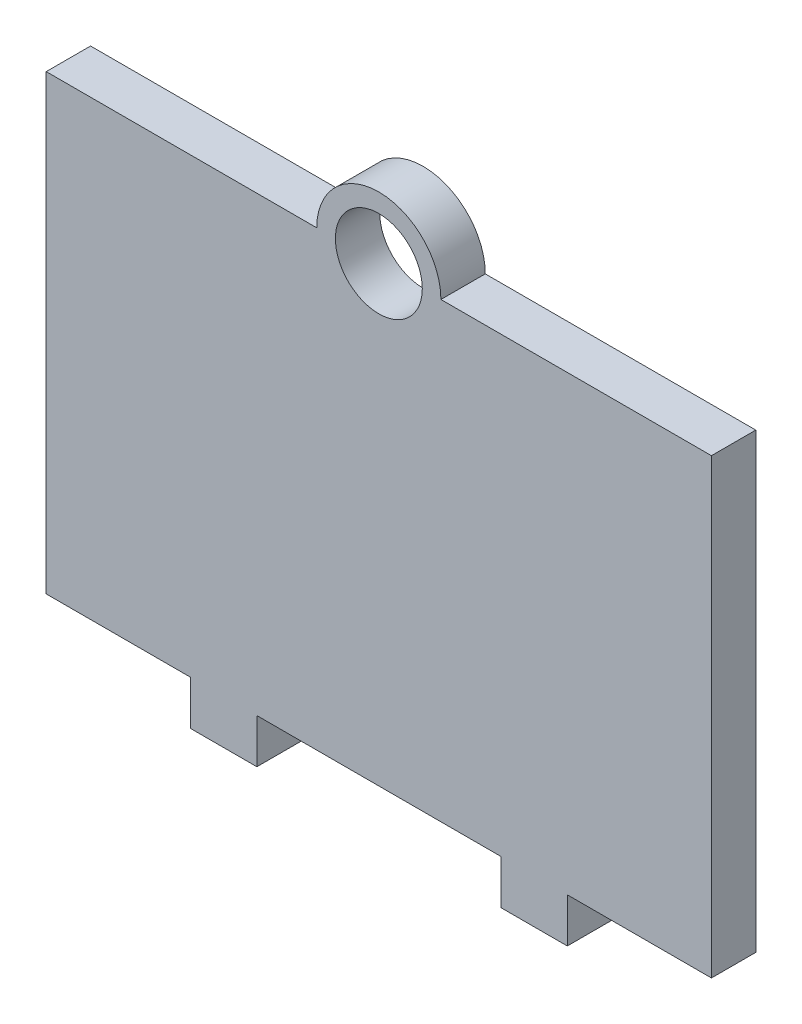
ISO-10303-21;
HEADER;
FILE_DESCRIPTION(('STEP AP214'),'2;1');
FILE_NAME('part.step','',(''),(''),'','','');
FILE_SCHEMA(('AUTOMOTIVE_DESIGN { 1 0 10303 214 1 1 1 1 }'));
ENDSEC;
DATA;
#1=APPLICATION_CONTEXT('core data for automotive mechanical design processes');
#2=APPLICATION_PROTOCOL_DEFINITION('international standard','automotive_design',2000,#1);
#3=PRODUCT_CONTEXT('',#1,'mechanical');
#4=PRODUCT('Part','Part','',(#3));
#5=PRODUCT_RELATED_PRODUCT_CATEGORY('part','',(#4));
#6=PRODUCT_DEFINITION_FORMATION('','',#4);
#7=PRODUCT_DEFINITION_CONTEXT('part definition',#1,'design');
#8=PRODUCT_DEFINITION('design','',#6,#7);
#9=PRODUCT_DEFINITION_SHAPE('','',#8);
#10=(LENGTH_UNIT() NAMED_UNIT(*) SI_UNIT(.MILLI.,.METRE.));
#11=(NAMED_UNIT(*) PLANE_ANGLE_UNIT() SI_UNIT($,.RADIAN.));
#12=(NAMED_UNIT(*) SI_UNIT($,.STERADIAN.) SOLID_ANGLE_UNIT());
#13=UNCERTAINTY_MEASURE_WITH_UNIT(LENGTH_MEASURE(1.E-05),#10,'distance_accuracy_value','');
#14=(GEOMETRIC_REPRESENTATION_CONTEXT(3) GLOBAL_UNCERTAINTY_ASSIGNED_CONTEXT((#13)) GLOBAL_UNIT_ASSIGNED_CONTEXT((#10,
#11,#12)) REPRESENTATION_CONTEXT('',''));
#15=CARTESIAN_POINT('',(0.,0.,0.));
#16=DIRECTION('',(0.,0.,1.));
#17=DIRECTION('',(1.,0.,0.));
#18=AXIS2_PLACEMENT_3D('',#15,#16,#17);
#19=CARTESIAN_POINT('',(-95.25,142.24,-12.7));
#20=DIRECTION('',(-1.,0.,0.));
#21=DIRECTION('',(0.,-1.,0.));
#22=AXIS2_PLACEMENT_3D('',#19,#20,#21);
#23=PLANE('',#22);
#24=DIRECTION('',(0.,-1.,0.));
#25=VECTOR('',#24,1.);
#26=CARTESIAN_POINT('',(-95.25,142.24,0.));
#27=LINE('',#26,#25);
#28=CARTESIAN_POINT('',(-95.25,142.24,0.));
#29=VERTEX_POINT('',#28);
#30=CARTESIAN_POINT('',(-95.25,12.7,0.));
#31=VERTEX_POINT('',#30);
#32=EDGE_CURVE('E176',#29,#31,#27,.T.);
#33=ORIENTED_EDGE('',*,*,#32,.F.);
#34=DIRECTION('',(0.,0.,1.));
#35=VECTOR('',#34,1.);
#36=CARTESIAN_POINT('',(-95.25,142.24,-12.7));
#37=LINE('',#36,#35);
#38=CARTESIAN_POINT('',(-95.25,142.24,-12.7));
#39=VERTEX_POINT('',#38);
#40=EDGE_CURVE('E13',#39,#29,#37,.T.);
#41=ORIENTED_EDGE('',*,*,#40,.F.);
#42=DIRECTION('',(0.,-1.,0.));
#43=VECTOR('',#42,1.);
#44=CARTESIAN_POINT('',(-95.25,142.24,-12.7));
#45=LINE('',#44,#43);
#46=CARTESIAN_POINT('',(-95.25,12.7,-12.7));
#47=VERTEX_POINT('',#46);
#48=EDGE_CURVE('E215',#39,#47,#45,.T.);
#49=ORIENTED_EDGE('',*,*,#48,.T.);
#50=DIRECTION('',(0.,0.,1.));
#51=VECTOR('',#50,1.);
#52=CARTESIAN_POINT('',(-95.25,12.7,-12.7));
#53=LINE('',#52,#51);
#54=EDGE_CURVE('E46',#47,#31,#53,.T.);
#55=ORIENTED_EDGE('',*,*,#54,.T.);
#56=EDGE_LOOP('',(#33,#41,#49,#55));
#57=FACE_BOUND('',#56,.T.);
#58=ADVANCED_FACE('F43',(#57),#23,.T.);
#59=CARTESIAN_POINT('',(-95.25,142.24,-12.7));
#60=DIRECTION('',(0.,1.,0.));
#61=DIRECTION('',(0.,0.,1.));
#62=AXIS2_PLACEMENT_3D('',#59,#60,#61);
#63=PLANE('',#62);
#64=DIRECTION('',(-1.,0.,0.));
#65=VECTOR('',#64,1.);
#66=CARTESIAN_POINT('',(-95.25,142.24,0.));
#67=LINE('',#66,#65);
#68=CARTESIAN_POINT('',(-17.78,142.24,0.));
#69=VERTEX_POINT('',#68);
#70=EDGE_CURVE('E213',#69,#29,#67,.T.);
#71=ORIENTED_EDGE('',*,*,#70,.F.);
#72=DIRECTION('',(0.,0.,1.));
#73=VECTOR('',#72,1.);
#74=CARTESIAN_POINT('',(-17.78,142.24,-12.7));
#75=LINE('',#74,#73);
#76=CARTESIAN_POINT('',(-17.78,142.24,-12.7));
#77=VERTEX_POINT('',#76);
#78=EDGE_CURVE('E52',#77,#69,#75,.T.);
#79=ORIENTED_EDGE('',*,*,#78,.F.);
#80=DIRECTION('',(-1.,0.,0.));
#81=VECTOR('',#80,1.);
#82=CARTESIAN_POINT('',(-95.25,142.24,-12.7));
#83=LINE('',#82,#81);
#84=EDGE_CURVE('E166',#77,#39,#83,.T.);
#85=ORIENTED_EDGE('',*,*,#84,.T.);
#86=ORIENTED_EDGE('',*,*,#40,.T.);
#87=EDGE_LOOP('',(#71,#79,#85,#86));
#88=FACE_BOUND('',#87,.T.);
#89=ADVANCED_FACE('F239',(#88),#63,.T.);
#90=CARTESIAN_POINT('',(0.,142.24,-12.7));
#91=DIRECTION('',(0.,0.,1.));
#92=DIRECTION('',(1.,0.,0.));
#93=AXIS2_PLACEMENT_3D('',#90,#91,#92);
#94=CYLINDRICAL_SURFACE('',#93,17.78);
#95=CARTESIAN_POINT('',(0.,142.24,0.));
#96=DIRECTION('',(0.,0.,1.));
#97=DIRECTION('',(1.,0.,0.));
#98=AXIS2_PLACEMENT_3D('',#95,#96,#97);
#99=CIRCLE('',#98,17.78);
#100=CARTESIAN_POINT('',(17.78,142.24,0.));
#101=VERTEX_POINT('',#100);
#102=EDGE_CURVE('E153',#101,#69,#99,.T.);
#103=ORIENTED_EDGE('',*,*,#102,.F.);
#104=DIRECTION('',(0.,0.,1.));
#105=VECTOR('',#104,1.);
#106=CARTESIAN_POINT('',(17.78,142.24,-12.7));
#107=LINE('',#106,#105);
#108=CARTESIAN_POINT('',(17.78,142.24,-12.7));
#109=VERTEX_POINT('',#108);
#110=EDGE_CURVE('E148',#109,#101,#107,.T.);
#111=ORIENTED_EDGE('',*,*,#110,.F.);
#112=CARTESIAN_POINT('',(0.,142.24,-12.7));
#113=DIRECTION('',(0.,0.,1.));
#114=DIRECTION('',(1.,0.,0.));
#115=AXIS2_PLACEMENT_3D('',#112,#113,#114);
#116=CIRCLE('',#115,17.78);
#117=EDGE_CURVE('E151',#109,#77,#116,.T.);
#118=ORIENTED_EDGE('',*,*,#117,.T.);
#119=ORIENTED_EDGE('',*,*,#78,.T.);
#120=EDGE_LOOP('',(#103,#111,#118,#119));
#121=FACE_BOUND('',#120,.T.);
#122=ADVANCED_FACE('F150',(#121),#94,.T.);
#123=CARTESIAN_POINT('',(17.78,142.24,-12.7));
#124=DIRECTION('',(0.,1.,0.));
#125=DIRECTION('',(0.,0.,1.));
#126=AXIS2_PLACEMENT_3D('',#123,#124,#125);
#127=PLANE('',#126);
#128=DIRECTION('',(-1.,0.,0.));
#129=VECTOR('',#128,1.);
#130=CARTESIAN_POINT('',(17.78,142.24,0.));
#131=LINE('',#130,#129);
#132=CARTESIAN_POINT('',(95.25,142.24,0.));
#133=VERTEX_POINT('',#132);
#134=EDGE_CURVE('E210',#133,#101,#131,.T.);
#135=ORIENTED_EDGE('',*,*,#134,.F.);
#136=DIRECTION('',(0.,0.,1.));
#137=VECTOR('',#136,1.);
#138=CARTESIAN_POINT('',(95.25,142.24,-12.7));
#139=LINE('',#138,#137);
#140=CARTESIAN_POINT('',(95.25,142.24,-12.7));
#141=VERTEX_POINT('',#140);
#142=EDGE_CURVE('E158',#141,#133,#139,.T.);
#143=ORIENTED_EDGE('',*,*,#142,.F.);
#144=DIRECTION('',(-1.,0.,0.));
#145=VECTOR('',#144,1.);
#146=CARTESIAN_POINT('',(17.78,142.24,-12.7));
#147=LINE('',#146,#145);
#148=EDGE_CURVE('E164',#141,#109,#147,.T.);
#149=ORIENTED_EDGE('',*,*,#148,.T.);
#150=ORIENTED_EDGE('',*,*,#110,.T.);
#151=EDGE_LOOP('',(#135,#143,#149,#150));
#152=FACE_BOUND('',#151,.T.);
#153=ADVANCED_FACE('F168',(#152),#127,.T.);
#154=CARTESIAN_POINT('',(95.25,142.24,-12.7));
#155=DIRECTION('',(1.,0.,0.));
#156=DIRECTION('',(0.,0.,-1.));
#157=AXIS2_PLACEMENT_3D('',#154,#155,#156);
#158=PLANE('',#157);
#159=DIRECTION('',(0.,1.,0.));
#160=VECTOR('',#159,1.);
#161=CARTESIAN_POINT('',(95.25,142.24,0.));
#162=LINE('',#161,#160);
#163=CARTESIAN_POINT('',(95.25,12.7,0.));
#164=VERTEX_POINT('',#163);
#165=EDGE_CURVE('E207',#164,#133,#162,.T.);
#166=ORIENTED_EDGE('',*,*,#165,.F.);
#167=DIRECTION('',(0.,0.,1.));
#168=VECTOR('',#167,1.);
#169=CARTESIAN_POINT('',(95.25,12.7,-12.7));
#170=LINE('',#169,#168);
#171=CARTESIAN_POINT('',(95.25,12.7,-12.7));
#172=VERTEX_POINT('',#171);
#173=EDGE_CURVE('E219',#172,#164,#170,.T.);
#174=ORIENTED_EDGE('',*,*,#173,.F.);
#175=DIRECTION('',(0.,1.,0.));
#176=VECTOR('',#175,1.);
#177=CARTESIAN_POINT('',(95.25,142.24,-12.7));
#178=LINE('',#177,#176);
#179=EDGE_CURVE('E169',#172,#141,#178,.T.);
#180=ORIENTED_EDGE('',*,*,#179,.T.);
#181=ORIENTED_EDGE('',*,*,#142,.T.);
#182=EDGE_LOOP('',(#166,#174,#180,#181));
#183=FACE_BOUND('',#182,.T.);
#184=ADVANCED_FACE('F252',(#183),#158,.T.);
#185=CARTESIAN_POINT('',(53.975,12.7,-12.7));
#186=DIRECTION('',(0.,-1.,0.));
#187=DIRECTION('',(0.,0.,-1.));
#188=AXIS2_PLACEMENT_3D('',#185,#186,#187);
#189=PLANE('',#188);
#190=DIRECTION('',(1.,0.,0.));
#191=VECTOR('',#190,1.);
#192=CARTESIAN_POINT('',(53.975,12.7,0.));
#193=LINE('',#192,#191);
#194=CARTESIAN_POINT('',(53.975,12.7,0.));
#195=VERTEX_POINT('',#194);
#196=EDGE_CURVE('E204',#195,#164,#193,.T.);
#197=ORIENTED_EDGE('',*,*,#196,.F.);
#198=DIRECTION('',(0.,0.,1.));
#199=VECTOR('',#198,1.);
#200=CARTESIAN_POINT('',(53.975,12.7,-12.7));
#201=LINE('',#200,#199);
#202=CARTESIAN_POINT('',(53.975,12.7,-12.7));
#203=VERTEX_POINT('',#202);
#204=EDGE_CURVE('E221',#203,#195,#201,.T.);
#205=ORIENTED_EDGE('',*,*,#204,.F.);
#206=DIRECTION('',(1.,0.,0.));
#207=VECTOR('',#206,1.);
#208=CARTESIAN_POINT('',(53.975,12.7,-12.7));
#209=LINE('',#208,#207);
#210=EDGE_CURVE('E171',#203,#172,#209,.T.);
#211=ORIENTED_EDGE('',*,*,#210,.T.);
#212=ORIENTED_EDGE('',*,*,#173,.T.);
#213=EDGE_LOOP('',(#197,#205,#211,#212));
#214=FACE_BOUND('',#213,.T.);
#215=ADVANCED_FACE('F255',(#214),#189,.T.);
#216=CARTESIAN_POINT('',(53.975,0.,-12.7));
#217=DIRECTION('',(1.,0.,0.));
#218=DIRECTION('',(0.,0.,-1.));
#219=AXIS2_PLACEMENT_3D('',#216,#217,#218);
#220=PLANE('',#219);
#221=DIRECTION('',(0.,1.,0.));
#222=VECTOR('',#221,1.);
#223=CARTESIAN_POINT('',(53.975,0.,0.));
#224=LINE('',#223,#222);
#225=CARTESIAN_POINT('',(53.975,0.,0.));
#226=VERTEX_POINT('',#225);
#227=EDGE_CURVE('E201',#226,#195,#224,.T.);
#228=ORIENTED_EDGE('',*,*,#227,.F.);
#229=DIRECTION('',(0.,0.,1.));
#230=VECTOR('',#229,1.);
#231=CARTESIAN_POINT('',(53.975,0.,-12.7));
#232=LINE('',#231,#230);
#233=CARTESIAN_POINT('',(53.975,0.,-12.7));
#234=VERTEX_POINT('',#233);
#235=EDGE_CURVE('E223',#234,#226,#232,.T.);
#236=ORIENTED_EDGE('',*,*,#235,.F.);
#237=DIRECTION('',(0.,1.,0.));
#238=VECTOR('',#237,1.);
#239=CARTESIAN_POINT('',(53.975,0.,-12.7));
#240=LINE('',#239,#238);
#241=EDGE_CURVE('E332',#234,#203,#240,.T.);
#242=ORIENTED_EDGE('',*,*,#241,.T.);
#243=ORIENTED_EDGE('',*,*,#204,.T.);
#244=EDGE_LOOP('',(#228,#236,#242,#243));
#245=FACE_BOUND('',#244,.T.);
#246=ADVANCED_FACE('F259',(#245),#220,.T.);
#247=CARTESIAN_POINT('',(53.975,0.,-12.7));
#248=DIRECTION('',(0.,-1.,0.));
#249=DIRECTION('',(0.,0.,-1.));
#250=AXIS2_PLACEMENT_3D('',#247,#248,#249);
#251=PLANE('',#250);
#252=DIRECTION('',(1.,0.,0.));
#253=VECTOR('',#252,1.);
#254=CARTESIAN_POINT('',(53.975,0.,0.));
#255=LINE('',#254,#253);
#256=CARTESIAN_POINT('',(34.925,0.,0.));
#257=VERTEX_POINT('',#256);
#258=EDGE_CURVE('E198',#257,#226,#255,.T.);
#259=ORIENTED_EDGE('',*,*,#258,.F.);
#260=DIRECTION('',(0.,0.,1.));
#261=VECTOR('',#260,1.);
#262=CARTESIAN_POINT('',(34.925,0.,-12.7));
#263=LINE('',#262,#261);
#264=CARTESIAN_POINT('',(34.925,0.,-12.7));
#265=VERTEX_POINT('',#264);
#266=EDGE_CURVE('E225',#265,#257,#263,.T.);
#267=ORIENTED_EDGE('',*,*,#266,.F.);
#268=DIRECTION('',(1.,0.,0.));
#269=VECTOR('',#268,1.);
#270=CARTESIAN_POINT('',(53.975,0.,-12.7));
#271=LINE('',#270,#269);
#272=EDGE_CURVE('E329',#265,#234,#271,.T.);
#273=ORIENTED_EDGE('',*,*,#272,.T.);
#274=ORIENTED_EDGE('',*,*,#235,.T.);
#275=EDGE_LOOP('',(#259,#267,#273,#274));
#276=FACE_BOUND('',#275,.T.);
#277=ADVANCED_FACE('F263',(#276),#251,.T.);
#278=CARTESIAN_POINT('',(34.925,0.,-12.7));
#279=DIRECTION('',(-1.,0.,0.));
#280=DIRECTION('',(0.,0.,1.));
#281=AXIS2_PLACEMENT_3D('',#278,#279,#280);
#282=PLANE('',#281);
#283=DIRECTION('',(0.,-1.,0.));
#284=VECTOR('',#283,1.);
#285=CARTESIAN_POINT('',(34.925,0.,0.));
#286=LINE('',#285,#284);
#287=CARTESIAN_POINT('',(34.925,12.7,0.));
#288=VERTEX_POINT('',#287);
#289=EDGE_CURVE('E195',#288,#257,#286,.T.);
#290=ORIENTED_EDGE('',*,*,#289,.F.);
#291=DIRECTION('',(0.,0.,1.));
#292=VECTOR('',#291,1.);
#293=CARTESIAN_POINT('',(34.925,12.7,-12.7));
#294=LINE('',#293,#292);
#295=CARTESIAN_POINT('',(34.925,12.7,-12.7));
#296=VERTEX_POINT('',#295);
#297=EDGE_CURVE('E227',#296,#288,#294,.T.);
#298=ORIENTED_EDGE('',*,*,#297,.F.);
#299=DIRECTION('',(0.,-1.,0.));
#300=VECTOR('',#299,1.);
#301=CARTESIAN_POINT('',(34.925,0.,-12.7));
#302=LINE('',#301,#300);
#303=EDGE_CURVE('E326',#296,#265,#302,.T.);
#304=ORIENTED_EDGE('',*,*,#303,.T.);
#305=ORIENTED_EDGE('',*,*,#266,.T.);
#306=EDGE_LOOP('',(#290,#298,#304,#305));
#307=FACE_BOUND('',#306,.T.);
#308=ADVANCED_FACE('F267',(#307),#282,.T.);
#309=CARTESIAN_POINT('',(-34.925,12.7,-12.7));
#310=DIRECTION('',(0.,-1.,0.));
#311=DIRECTION('',(0.,0.,-1.));
#312=AXIS2_PLACEMENT_3D('',#309,#310,#311);
#313=PLANE('',#312);
#314=DIRECTION('',(1.,0.,0.));
#315=VECTOR('',#314,1.);
#316=CARTESIAN_POINT('',(-34.925,12.7,0.));
#317=LINE('',#316,#315);
#318=CARTESIAN_POINT('',(-34.925,12.7,0.));
#319=VERTEX_POINT('',#318);
#320=EDGE_CURVE('E192',#319,#288,#317,.T.);
#321=ORIENTED_EDGE('',*,*,#320,.F.);
#322=DIRECTION('',(0.,0.,1.));
#323=VECTOR('',#322,1.);
#324=CARTESIAN_POINT('',(-34.925,12.7,-12.7));
#325=LINE('',#324,#323);
#326=CARTESIAN_POINT('',(-34.925,12.7,-12.7));
#327=VERTEX_POINT('',#326);
#328=EDGE_CURVE('E229',#327,#319,#325,.T.);
#329=ORIENTED_EDGE('',*,*,#328,.F.);
#330=DIRECTION('',(1.,0.,0.));
#331=VECTOR('',#330,1.);
#332=CARTESIAN_POINT('',(-34.925,12.7,-12.7));
#333=LINE('',#332,#331);
#334=EDGE_CURVE('E323',#327,#296,#333,.T.);
#335=ORIENTED_EDGE('',*,*,#334,.T.);
#336=ORIENTED_EDGE('',*,*,#297,.T.);
#337=EDGE_LOOP('',(#321,#329,#335,#336));
#338=FACE_BOUND('',#337,.T.);
#339=ADVANCED_FACE('F271',(#338),#313,.T.);
#340=CARTESIAN_POINT('',(-34.925,0.,-12.7));
#341=DIRECTION('',(1.,0.,0.));
#342=DIRECTION('',(0.,0.,-1.));
#343=AXIS2_PLACEMENT_3D('',#340,#341,#342);
#344=PLANE('',#343);
#345=DIRECTION('',(0.,1.,0.));
#346=VECTOR('',#345,1.);
#347=CARTESIAN_POINT('',(-34.925,0.,0.));
#348=LINE('',#347,#346);
#349=CARTESIAN_POINT('',(-34.925,0.,0.));
#350=VERTEX_POINT('',#349);
#351=EDGE_CURVE('E189',#350,#319,#348,.T.);
#352=ORIENTED_EDGE('',*,*,#351,.F.);
#353=DIRECTION('',(0.,0.,1.));
#354=VECTOR('',#353,1.);
#355=CARTESIAN_POINT('',(-34.925,0.,-12.7));
#356=LINE('',#355,#354);
#357=CARTESIAN_POINT('',(-34.925,0.,-12.7));
#358=VERTEX_POINT('',#357);
#359=EDGE_CURVE('E231',#358,#350,#356,.T.);
#360=ORIENTED_EDGE('',*,*,#359,.F.);
#361=DIRECTION('',(0.,1.,0.));
#362=VECTOR('',#361,1.);
#363=CARTESIAN_POINT('',(-34.925,0.,-12.7));
#364=LINE('',#363,#362);
#365=EDGE_CURVE('E320',#358,#327,#364,.T.);
#366=ORIENTED_EDGE('',*,*,#365,.T.);
#367=ORIENTED_EDGE('',*,*,#328,.T.);
#368=EDGE_LOOP('',(#352,#360,#366,#367));
#369=FACE_BOUND('',#368,.T.);
#370=ADVANCED_FACE('F275',(#369),#344,.T.);
#371=CARTESIAN_POINT('',(-34.925,0.,-12.7));
#372=DIRECTION('',(0.,-1.,0.));
#373=DIRECTION('',(0.,0.,-1.));
#374=AXIS2_PLACEMENT_3D('',#371,#372,#373);
#375=PLANE('',#374);
#376=DIRECTION('',(1.,0.,0.));
#377=VECTOR('',#376,1.);
#378=CARTESIAN_POINT('',(-34.925,0.,0.));
#379=LINE('',#378,#377);
#380=CARTESIAN_POINT('',(-53.975,0.,0.));
#381=VERTEX_POINT('',#380);
#382=EDGE_CURVE('E186',#381,#350,#379,.T.);
#383=ORIENTED_EDGE('',*,*,#382,.F.);
#384=DIRECTION('',(0.,0.,1.));
#385=VECTOR('',#384,1.);
#386=CARTESIAN_POINT('',(-53.975,0.,-12.7));
#387=LINE('',#386,#385);
#388=CARTESIAN_POINT('',(-53.975,0.,-12.7));
#389=VERTEX_POINT('',#388);
#390=EDGE_CURVE('E233',#389,#381,#387,.T.);
#391=ORIENTED_EDGE('',*,*,#390,.F.);
#392=DIRECTION('',(1.,0.,0.));
#393=VECTOR('',#392,1.);
#394=CARTESIAN_POINT('',(-34.925,0.,-12.7));
#395=LINE('',#394,#393);
#396=EDGE_CURVE('E317',#389,#358,#395,.T.);
#397=ORIENTED_EDGE('',*,*,#396,.T.);
#398=ORIENTED_EDGE('',*,*,#359,.T.);
#399=EDGE_LOOP('',(#383,#391,#397,#398));
#400=FACE_BOUND('',#399,.T.);
#401=ADVANCED_FACE('F279',(#400),#375,.T.);
#402=CARTESIAN_POINT('',(-53.975,0.,-12.7));
#403=DIRECTION('',(-1.,0.,0.));
#404=DIRECTION('',(0.,0.,1.));
#405=AXIS2_PLACEMENT_3D('',#402,#403,#404);
#406=PLANE('',#405);
#407=DIRECTION('',(0.,-1.,0.));
#408=VECTOR('',#407,1.);
#409=CARTESIAN_POINT('',(-53.975,0.,0.));
#410=LINE('',#409,#408);
#411=CARTESIAN_POINT('',(-53.975,12.7,0.));
#412=VERTEX_POINT('',#411);
#413=EDGE_CURVE('E183',#412,#381,#410,.T.);
#414=ORIENTED_EDGE('',*,*,#413,.F.);
#415=DIRECTION('',(0.,0.,1.));
#416=VECTOR('',#415,1.);
#417=CARTESIAN_POINT('',(-53.975,12.7,-12.7));
#418=LINE('',#417,#416);
#419=CARTESIAN_POINT('',(-53.975,12.7,-12.7));
#420=VERTEX_POINT('',#419);
#421=EDGE_CURVE('E234',#420,#412,#418,.T.);
#422=ORIENTED_EDGE('',*,*,#421,.F.);
#423=DIRECTION('',(0.,-1.,0.));
#424=VECTOR('',#423,1.);
#425=CARTESIAN_POINT('',(-53.975,0.,-12.7));
#426=LINE('',#425,#424);
#427=EDGE_CURVE('E314',#420,#389,#426,.T.);
#428=ORIENTED_EDGE('',*,*,#427,.T.);
#429=ORIENTED_EDGE('',*,*,#390,.T.);
#430=EDGE_LOOP('',(#414,#422,#428,#429));
#431=FACE_BOUND('',#430,.T.);
#432=ADVANCED_FACE('F283',(#431),#406,.T.);
#433=CARTESIAN_POINT('',(-95.25,12.7,-12.7));
#434=DIRECTION('',(0.,-1.,0.));
#435=DIRECTION('',(0.,0.,-1.));
#436=AXIS2_PLACEMENT_3D('',#433,#434,#435);
#437=PLANE('',#436);
#438=DIRECTION('',(1.,0.,0.));
#439=VECTOR('',#438,1.);
#440=CARTESIAN_POINT('',(-95.25,12.7,0.));
#441=LINE('',#440,#439);
#442=EDGE_CURVE('E179',#31,#412,#441,.T.);
#443=ORIENTED_EDGE('',*,*,#442,.F.);
#444=ORIENTED_EDGE('',*,*,#54,.F.);
#445=DIRECTION('',(1.,0.,0.));
#446=VECTOR('',#445,1.);
#447=CARTESIAN_POINT('',(-95.25,12.7,-12.7));
#448=LINE('',#447,#446);
#449=EDGE_CURVE('E312',#47,#420,#448,.T.);
#450=ORIENTED_EDGE('',*,*,#449,.T.);
#451=ORIENTED_EDGE('',*,*,#421,.T.);
#452=EDGE_LOOP('',(#443,#444,#450,#451));
#453=FACE_BOUND('',#452,.T.);
#454=ADVANCED_FACE('F236',(#453),#437,.T.);
#455=CARTESIAN_POINT('',(0.,142.24,-12.7));
#456=DIRECTION('',(0.,0.,1.));
#457=DIRECTION('',(1.,0.,0.));
#458=AXIS2_PLACEMENT_3D('',#455,#456,#457);
#459=PLANE('',#458);
#460=CARTESIAN_POINT('',(0.,142.24,-12.7));
#461=DIRECTION('',(0.,0.,1.));
#462=DIRECTION('',(1.,0.,0.));
#463=AXIS2_PLACEMENT_3D('',#460,#461,#462);
#464=CIRCLE('',#463,12.446);
#465=CARTESIAN_POINT('',(12.446,142.24,-12.7));
#466=VERTEX_POINT('',#465);
#467=EDGE_CURVE('E180',#466,#466,#464,.T.);
#468=ORIENTED_EDGE('',*,*,#467,.T.);
#469=EDGE_LOOP('',(#468));
#470=FACE_BOUND('',#469,.T.);
#471=ORIENTED_EDGE('',*,*,#48,.F.);
#472=ORIENTED_EDGE('',*,*,#84,.F.);
#473=ORIENTED_EDGE('',*,*,#117,.F.);
#474=ORIENTED_EDGE('',*,*,#148,.F.);
#475=ORIENTED_EDGE('',*,*,#179,.F.);
#476=ORIENTED_EDGE('',*,*,#210,.F.);
#477=ORIENTED_EDGE('',*,*,#241,.F.);
#478=ORIENTED_EDGE('',*,*,#272,.F.);
#479=ORIENTED_EDGE('',*,*,#303,.F.);
#480=ORIENTED_EDGE('',*,*,#334,.F.);
#481=ORIENTED_EDGE('',*,*,#365,.F.);
#482=ORIENTED_EDGE('',*,*,#396,.F.);
#483=ORIENTED_EDGE('',*,*,#427,.F.);
#484=ORIENTED_EDGE('',*,*,#449,.F.);
#485=EDGE_LOOP('',(#471,#472,#473,#474,#475,#476,#477,#478,#479,#480,#481,#482,#483,#484));
#486=FACE_BOUND('',#485,.T.);
#487=ADVANCED_FACE('F162',(#470,#486),#459,.F.);
#488=CARTESIAN_POINT('',(0.,142.24,0.));
#489=DIRECTION('',(0.,0.,1.));
#490=DIRECTION('',(1.,0.,0.));
#491=AXIS2_PLACEMENT_3D('',#488,#489,#490);
#492=PLANE('',#491);
#493=CARTESIAN_POINT('',(0.,142.24,0.));
#494=DIRECTION('',(0.,0.,1.));
#495=DIRECTION('',(1.,0.,0.));
#496=AXIS2_PLACEMENT_3D('',#493,#494,#495);
#497=CIRCLE('',#496,12.446);
#498=CARTESIAN_POINT('',(12.446,142.24,0.));
#499=VERTEX_POINT('',#498);
#500=EDGE_CURVE('E307',#499,#499,#497,.T.);
#501=ORIENTED_EDGE('',*,*,#500,.F.);
#502=EDGE_LOOP('',(#501));
#503=FACE_BOUND('',#502,.T.);
#504=ORIENTED_EDGE('',*,*,#32,.T.);
#505=ORIENTED_EDGE('',*,*,#442,.T.);
#506=ORIENTED_EDGE('',*,*,#413,.T.);
#507=ORIENTED_EDGE('',*,*,#382,.T.);
#508=ORIENTED_EDGE('',*,*,#351,.T.);
#509=ORIENTED_EDGE('',*,*,#320,.T.);
#510=ORIENTED_EDGE('',*,*,#289,.T.);
#511=ORIENTED_EDGE('',*,*,#258,.T.);
#512=ORIENTED_EDGE('',*,*,#227,.T.);
#513=ORIENTED_EDGE('',*,*,#196,.T.);
#514=ORIENTED_EDGE('',*,*,#165,.T.);
#515=ORIENTED_EDGE('',*,*,#134,.T.);
#516=ORIENTED_EDGE('',*,*,#102,.T.);
#517=ORIENTED_EDGE('',*,*,#70,.T.);
#518=EDGE_LOOP('',(#504,#505,#506,#507,#508,#509,#510,#511,#512,#513,#514,#515,#516,#517));
#519=FACE_BOUND('',#518,.T.);
#520=ADVANCED_FACE('F238',(#503,#519),#492,.T.);
#521=CARTESIAN_POINT('',(0.,142.24,-12.7));
#522=DIRECTION('',(0.,0.,1.));
#523=DIRECTION('',(1.,0.,0.));
#524=AXIS2_PLACEMENT_3D('',#521,#522,#523);
#525=CYLINDRICAL_SURFACE('',#524,12.446);
#526=ORIENTED_EDGE('',*,*,#467,.F.);
#527=EDGE_LOOP('',(#526));
#528=FACE_BOUND('',#527,.T.);
#529=ORIENTED_EDGE('',*,*,#500,.T.);
#530=EDGE_LOOP('',(#529));
#531=FACE_BOUND('',#530,.T.);
#532=ADVANCED_FACE('F295',(#528,#531),#525,.F.);
#533=CLOSED_SHELL('',(#58,#89,#122,#153,#184,#215,#246,#277,#308,#339,#370,#401,#432,#454,#487,
#520,#532));
#534=MANIFOLD_SOLID_BREP('B2',#533);
#535=ADVANCED_BREP_SHAPE_REPRESENTATION('',(#18,#534),#14);
#536=SHAPE_DEFINITION_REPRESENTATION(#9,#535);
ENDSEC;
END-ISO-10303-21;
